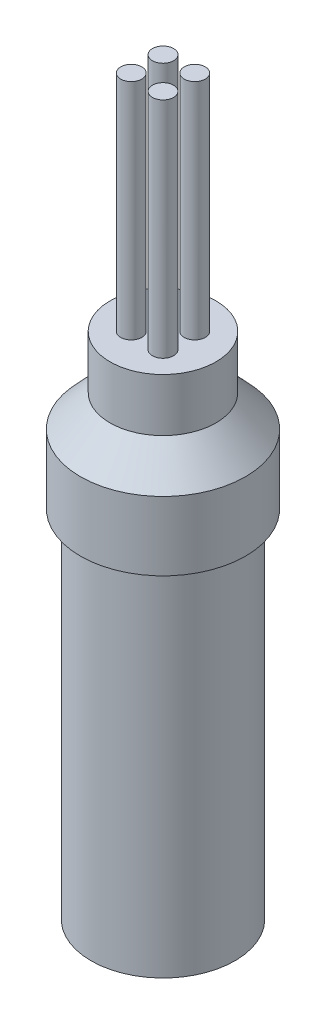
ISO-10303-21;
HEADER;
FILE_DESCRIPTION(('STEP AP214'),'2;1');
FILE_NAME('part.step','',(''),(''),'','','');
FILE_SCHEMA(('AUTOMOTIVE_DESIGN { 1 0 10303 214 1 1 1 1 }'));
ENDSEC;
DATA;
#1=APPLICATION_CONTEXT('core data for automotive mechanical design processes');
#2=APPLICATION_PROTOCOL_DEFINITION('international standard','automotive_design',2000,#1);
#3=PRODUCT_CONTEXT('',#1,'mechanical');
#4=PRODUCT('Part','Part','',(#3));
#5=PRODUCT_RELATED_PRODUCT_CATEGORY('part','',(#4));
#6=PRODUCT_DEFINITION_FORMATION('','',#4);
#7=PRODUCT_DEFINITION_CONTEXT('part definition',#1,'design');
#8=PRODUCT_DEFINITION('design','',#6,#7);
#9=PRODUCT_DEFINITION_SHAPE('','',#8);
#10=(LENGTH_UNIT() NAMED_UNIT(*) SI_UNIT(.MILLI.,.METRE.));
#11=(NAMED_UNIT(*) PLANE_ANGLE_UNIT() SI_UNIT($,.RADIAN.));
#12=(NAMED_UNIT(*) SI_UNIT($,.STERADIAN.) SOLID_ANGLE_UNIT());
#13=UNCERTAINTY_MEASURE_WITH_UNIT(LENGTH_MEASURE(1.E-05),#10,'distance_accuracy_value','');
#14=(GEOMETRIC_REPRESENTATION_CONTEXT(3) GLOBAL_UNCERTAINTY_ASSIGNED_CONTEXT((#13)) GLOBAL_UNIT_ASSIGNED_CONTEXT((#10,
#11,#12)) REPRESENTATION_CONTEXT('',''));
#15=CARTESIAN_POINT('',(0.,0.,0.));
#16=DIRECTION('',(0.,0.,1.));
#17=DIRECTION('',(1.,0.,0.));
#18=AXIS2_PLACEMENT_3D('',#15,#16,#17);
#19=CARTESIAN_POINT('',(0.,79.3219,0.));
#20=DIRECTION('',(0.,-1.,0.));
#21=DIRECTION('',(0.,0.,-1.));
#22=AXIS2_PLACEMENT_3D('',#19,#20,#21);
#23=CYLINDRICAL_SURFACE('',#22,3.3996);
#24=CARTESIAN_POINT('',(0.,60.2621,0.));
#25=DIRECTION('',(0.,1.,0.));
#26=DIRECTION('',(0.,0.,1.));
#27=AXIS2_PLACEMENT_3D('',#24,#25,#26);
#28=CIRCLE('',#27,3.3996);
#29=CARTESIAN_POINT('',(0.,60.2621,3.3996));
#30=VERTEX_POINT('',#29);
#31=EDGE_CURVE('E62',#30,#30,#28,.T.);
#32=ORIENTED_EDGE('',*,*,#31,.T.);
#33=EDGE_LOOP('',(#32));
#34=FACE_BOUND('',#33,.T.);
#35=CARTESIAN_POINT('',(0.,77.0719,0.));
#36=DIRECTION('',(0.,1.,0.));
#37=DIRECTION('',(0.,0.,1.));
#38=AXIS2_PLACEMENT_3D('',#35,#36,#37);
#39=CIRCLE('',#38,3.3996);
#40=CARTESIAN_POINT('',(0.,77.0719,3.3996));
#41=VERTEX_POINT('',#40);
#42=EDGE_CURVE('E59',#41,#41,#39,.T.);
#43=ORIENTED_EDGE('',*,*,#42,.F.);
#44=EDGE_LOOP('',(#43));
#45=FACE_BOUND('',#44,.T.);
#46=ADVANCED_FACE('F15',(#34,#45),#23,.T.);
#47=CARTESIAN_POINT('',(0.,60.2621,0.));
#48=DIRECTION('',(0.,1.,0.));
#49=DIRECTION('',(0.,0.,1.));
#50=AXIS2_PLACEMENT_3D('',#47,#48,#49);
#51=PLANE('',#50);
#52=ORIENTED_EDGE('',*,*,#31,.F.);
#53=EDGE_LOOP('',(#52));
#54=FACE_BOUND('',#53,.T.);
#55=ADVANCED_FACE('F68',(#54),#51,.F.);
#56=CARTESIAN_POINT('',(3.9,77.0719,0.));
#57=DIRECTION('',(0.,1.,0.));
#58=DIRECTION('',(0.,0.,1.));
#59=AXIS2_PLACEMENT_3D('',#56,#57,#58);
#60=PLANE('',#59);
#61=ORIENTED_EDGE('',*,*,#42,.T.);
#62=EDGE_LOOP('',(#61));
#63=FACE_BOUND('',#62,.T.);
#64=CARTESIAN_POINT('',(0.,77.0719,0.));
#65=DIRECTION('',(0.,-1.,0.));
#66=DIRECTION('',(0.,0.,-1.));
#67=AXIS2_PLACEMENT_3D('',#64,#65,#66);
#68=CIRCLE('',#67,3.9);
#69=CARTESIAN_POINT('',(0.,77.0719,-3.9));
#70=VERTEX_POINT('',#69);
#71=EDGE_CURVE('E56',#70,#70,#68,.T.);
#72=ORIENTED_EDGE('',*,*,#71,.T.);
#73=EDGE_LOOP('',(#72));
#74=FACE_BOUND('',#73,.T.);
#75=ADVANCED_FACE('F70',(#63,#74),#60,.F.);
#76=CARTESIAN_POINT('',(0.,77.0719,0.));
#77=DIRECTION('',(0.,-1.,0.));
#78=DIRECTION('',(0.,0.,-1.));
#79=AXIS2_PLACEMENT_3D('',#76,#77,#78);
#80=CYLINDRICAL_SURFACE('',#79,3.9);
#81=ORIENTED_EDGE('',*,*,#71,.F.);
#82=EDGE_LOOP('',(#81));
#83=FACE_BOUND('',#82,.T.);
#84=CARTESIAN_POINT('',(0.,80.3219,0.));
#85=DIRECTION('',(0.,-1.,0.));
#86=DIRECTION('',(0.,0.,-1.));
#87=AXIS2_PLACEMENT_3D('',#84,#85,#86);
#88=CIRCLE('',#87,3.9);
#89=CARTESIAN_POINT('',(0.,80.3219,-3.9));
#90=VERTEX_POINT('',#89);
#91=EDGE_CURVE('E53',#90,#90,#88,.T.);
#92=ORIENTED_EDGE('',*,*,#91,.T.);
#93=EDGE_LOOP('',(#92));
#94=FACE_BOUND('',#93,.T.);
#95=ADVANCED_FACE('F77',(#83,#94),#80,.T.);
#96=CARTESIAN_POINT('',(0.,81.8219,0.));
#97=DIRECTION('',(0.,-1.,0.));
#98=DIRECTION('',(0.,0.,-1.));
#99=AXIS2_PLACEMENT_3D('',#96,#97,#98);
#100=CONICAL_SURFACE('',#99,2.5,0.75092906239794);
#101=ORIENTED_EDGE('',*,*,#91,.F.);
#102=EDGE_LOOP('',(#101));
#103=FACE_BOUND('',#102,.T.);
#104=CARTESIAN_POINT('',(0.,81.8219,0.));
#105=DIRECTION('',(0.,-1.,0.));
#106=DIRECTION('',(0.,0.,-1.));
#107=AXIS2_PLACEMENT_3D('',#104,#105,#106);
#108=CIRCLE('',#107,2.5);
#109=CARTESIAN_POINT('',(0.,81.8219,-2.5));
#110=VERTEX_POINT('',#109);
#111=EDGE_CURVE('E50',#110,#110,#108,.T.);
#112=ORIENTED_EDGE('',*,*,#111,.T.);
#113=EDGE_LOOP('',(#112));
#114=FACE_BOUND('',#113,.T.);
#115=ADVANCED_FACE('F84',(#103,#114),#100,.T.);
#116=CARTESIAN_POINT('',(0.,77.0719,0.));
#117=DIRECTION('',(0.,-1.,0.));
#118=DIRECTION('',(0.,0.,-1.));
#119=AXIS2_PLACEMENT_3D('',#116,#117,#118);
#120=CYLINDRICAL_SURFACE('',#119,2.5);
#121=ORIENTED_EDGE('',*,*,#111,.F.);
#122=EDGE_LOOP('',(#121));
#123=FACE_BOUND('',#122,.T.);
#124=CARTESIAN_POINT('',(0.,84.3219,0.));
#125=DIRECTION('',(0.,-1.,0.));
#126=DIRECTION('',(0.,0.,-1.));
#127=AXIS2_PLACEMENT_3D('',#124,#125,#126);
#128=CIRCLE('',#127,2.5);
#129=CARTESIAN_POINT('',(0.,84.3219,-2.5));
#130=VERTEX_POINT('',#129);
#131=EDGE_CURVE('E47',#130,#130,#128,.T.);
#132=ORIENTED_EDGE('',*,*,#131,.T.);
#133=EDGE_LOOP('',(#132));
#134=FACE_BOUND('',#133,.T.);
#135=ADVANCED_FACE('F88',(#123,#134),#120,.T.);
#136=CARTESIAN_POINT('',(0.,84.3219,0.));
#137=DIRECTION('',(0.,-1.,0.));
#138=DIRECTION('',(0.,0.,-1.));
#139=AXIS2_PLACEMENT_3D('',#136,#137,#138);
#140=PLANE('',#139);
#141=ORIENTED_EDGE('',*,*,#131,.F.);
#142=EDGE_LOOP('',(#141));
#143=FACE_BOUND('',#142,.T.);
#144=CARTESIAN_POINT('',(0.75,84.3219,0.75));
#145=DIRECTION('',(0.,1.,0.));
#146=DIRECTION('',(0.,0.,-1.));
#147=AXIS2_PLACEMENT_3D('',#144,#145,#146);
#148=CIRCLE('',#147,0.5);
#149=CARTESIAN_POINT('',(0.75,84.3219,0.25));
#150=VERTEX_POINT('',#149);
#151=EDGE_CURVE('E44',#150,#150,#148,.T.);
#152=ORIENTED_EDGE('',*,*,#151,.F.);
#153=EDGE_LOOP('',(#152));
#154=FACE_BOUND('',#153,.T.);
#155=CARTESIAN_POINT('',(-0.75,84.3219,0.75));
#156=DIRECTION('',(0.,1.,0.));
#157=DIRECTION('',(0.,0.,-1.));
#158=AXIS2_PLACEMENT_3D('',#155,#156,#157);
#159=CIRCLE('',#158,0.5);
#160=CARTESIAN_POINT('',(-0.75,84.3219,0.25));
#161=VERTEX_POINT('',#160);
#162=EDGE_CURVE('E41',#161,#161,#159,.T.);
#163=ORIENTED_EDGE('',*,*,#162,.F.);
#164=EDGE_LOOP('',(#163));
#165=FACE_BOUND('',#164,.T.);
#166=CARTESIAN_POINT('',(-0.75,84.3219,-0.75));
#167=DIRECTION('',(0.,1.,0.));
#168=DIRECTION('',(0.,0.,-1.));
#169=AXIS2_PLACEMENT_3D('',#166,#167,#168);
#170=CIRCLE('',#169,0.5);
#171=CARTESIAN_POINT('',(-0.75,84.3219,-1.25));
#172=VERTEX_POINT('',#171);
#173=EDGE_CURVE('E38',#172,#172,#170,.T.);
#174=ORIENTED_EDGE('',*,*,#173,.F.);
#175=EDGE_LOOP('',(#174));
#176=FACE_BOUND('',#175,.T.);
#177=CARTESIAN_POINT('',(0.75,84.3219,-0.75));
#178=DIRECTION('',(0.,1.,0.));
#179=DIRECTION('',(0.,0.,-1.));
#180=AXIS2_PLACEMENT_3D('',#177,#178,#179);
#181=CIRCLE('',#180,0.5);
#182=CARTESIAN_POINT('',(0.75,84.3219,-1.25));
#183=VERTEX_POINT('',#182);
#184=EDGE_CURVE('E35',#183,#183,#181,.T.);
#185=ORIENTED_EDGE('',*,*,#184,.F.);
#186=EDGE_LOOP('',(#185));
#187=FACE_BOUND('',#186,.T.);
#188=ADVANCED_FACE('F92',(#143,#154,#165,#176,#187),#140,.F.);
#189=CARTESIAN_POINT('',(0.75,94.8948,0.75));
#190=DIRECTION('',(0.,-1.,0.));
#191=DIRECTION('',(0.,0.,-1.));
#192=AXIS2_PLACEMENT_3D('',#189,#190,#191);
#193=CYLINDRICAL_SURFACE('',#192,0.5);
#194=CARTESIAN_POINT('',(0.75,94.8948,0.75));
#195=DIRECTION('',(0.,1.,0.));
#196=DIRECTION('',(1.,0.,0.));
#197=AXIS2_PLACEMENT_3D('',#194,#195,#196);
#198=CIRCLE('',#197,0.5);
#199=CARTESIAN_POINT('',(1.25,94.8948,0.75));
#200=VERTEX_POINT('',#199);
#201=EDGE_CURVE('E30',#200,#200,#198,.T.);
#202=ORIENTED_EDGE('',*,*,#201,.F.);
#203=EDGE_LOOP('',(#202));
#204=FACE_BOUND('',#203,.T.);
#205=ORIENTED_EDGE('',*,*,#151,.T.);
#206=EDGE_LOOP('',(#205));
#207=FACE_BOUND('',#206,.T.);
#208=ADVANCED_FACE('F96',(#204,#207),#193,.T.);
#209=CARTESIAN_POINT('',(-0.75,94.8948,0.75));
#210=DIRECTION('',(0.,-1.,0.));
#211=DIRECTION('',(0.,0.,-1.));
#212=AXIS2_PLACEMENT_3D('',#209,#210,#211);
#213=CYLINDRICAL_SURFACE('',#212,0.5);
#214=CARTESIAN_POINT('',(-0.75,94.8948,0.75));
#215=DIRECTION('',(0.,1.,0.));
#216=DIRECTION('',(1.,0.,0.));
#217=AXIS2_PLACEMENT_3D('',#214,#215,#216);
#218=CIRCLE('',#217,0.5);
#219=CARTESIAN_POINT('',(-0.25,94.8948,0.75));
#220=VERTEX_POINT('',#219);
#221=EDGE_CURVE('E26',#220,#220,#218,.T.);
#222=ORIENTED_EDGE('',*,*,#221,.F.);
#223=EDGE_LOOP('',(#222));
#224=FACE_BOUND('',#223,.T.);
#225=ORIENTED_EDGE('',*,*,#162,.T.);
#226=EDGE_LOOP('',(#225));
#227=FACE_BOUND('',#226,.T.);
#228=ADVANCED_FACE('F100',(#224,#227),#213,.T.);
#229=CARTESIAN_POINT('',(-0.75,94.8948,-0.75));
#230=DIRECTION('',(0.,-1.,0.));
#231=DIRECTION('',(0.,0.,-1.));
#232=AXIS2_PLACEMENT_3D('',#229,#230,#231);
#233=CYLINDRICAL_SURFACE('',#232,0.5);
#234=CARTESIAN_POINT('',(-0.75,94.8948,-0.75));
#235=DIRECTION('',(0.,1.,0.));
#236=DIRECTION('',(1.,0.,0.));
#237=AXIS2_PLACEMENT_3D('',#234,#235,#236);
#238=CIRCLE('',#237,0.5);
#239=CARTESIAN_POINT('',(-0.25,94.8948,-0.75));
#240=VERTEX_POINT('',#239);
#241=EDGE_CURVE('E22',#240,#240,#238,.T.);
#242=ORIENTED_EDGE('',*,*,#241,.F.);
#243=EDGE_LOOP('',(#242));
#244=FACE_BOUND('',#243,.T.);
#245=ORIENTED_EDGE('',*,*,#173,.T.);
#246=EDGE_LOOP('',(#245));
#247=FACE_BOUND('',#246,.T.);
#248=ADVANCED_FACE('F104',(#244,#247),#233,.T.);
#249=CARTESIAN_POINT('',(0.75,94.8948,-0.75));
#250=DIRECTION('',(0.,-1.,0.));
#251=DIRECTION('',(0.,0.,-1.));
#252=AXIS2_PLACEMENT_3D('',#249,#250,#251);
#253=CYLINDRICAL_SURFACE('',#252,0.5);
#254=CARTESIAN_POINT('',(0.75,94.8948,-0.75));
#255=DIRECTION('',(0.,1.,0.));
#256=DIRECTION('',(1.,0.,0.));
#257=AXIS2_PLACEMENT_3D('',#254,#255,#256);
#258=CIRCLE('',#257,0.5);
#259=CARTESIAN_POINT('',(1.25,94.8948,-0.75));
#260=VERTEX_POINT('',#259);
#261=EDGE_CURVE('E10',#260,#260,#258,.T.);
#262=ORIENTED_EDGE('',*,*,#261,.F.);
#263=EDGE_LOOP('',(#262));
#264=FACE_BOUND('',#263,.T.);
#265=ORIENTED_EDGE('',*,*,#184,.T.);
#266=EDGE_LOOP('',(#265));
#267=FACE_BOUND('',#266,.T.);
#268=ADVANCED_FACE('F108',(#264,#267),#253,.T.);
#269=CARTESIAN_POINT('',(0.75,94.8948,0.75));
#270=DIRECTION('',(0.,1.,0.));
#271=DIRECTION('',(0.,0.,1.));
#272=AXIS2_PLACEMENT_3D('',#269,#270,#271);
#273=PLANE('',#272);
#274=ORIENTED_EDGE('',*,*,#201,.T.);
#275=EDGE_LOOP('',(#274));
#276=FACE_BOUND('',#275,.T.);
#277=ADVANCED_FACE('F112',(#276),#273,.T.);
#278=CARTESIAN_POINT('',(-0.75,94.8948,0.75));
#279=DIRECTION('',(0.,1.,0.));
#280=DIRECTION('',(0.,0.,1.));
#281=AXIS2_PLACEMENT_3D('',#278,#279,#280);
#282=PLANE('',#281);
#283=ORIENTED_EDGE('',*,*,#221,.T.);
#284=EDGE_LOOP('',(#283));
#285=FACE_BOUND('',#284,.T.);
#286=ADVANCED_FACE('F116',(#285),#282,.T.);
#287=CARTESIAN_POINT('',(-0.75,94.8948,-0.75));
#288=DIRECTION('',(0.,1.,0.));
#289=DIRECTION('',(0.,0.,1.));
#290=AXIS2_PLACEMENT_3D('',#287,#288,#289);
#291=PLANE('',#290);
#292=ORIENTED_EDGE('',*,*,#241,.T.);
#293=EDGE_LOOP('',(#292));
#294=FACE_BOUND('',#293,.T.);
#295=ADVANCED_FACE('F119',(#294),#291,.T.);
#296=CARTESIAN_POINT('',(0.75,94.8948,-0.75));
#297=DIRECTION('',(0.,1.,0.));
#298=DIRECTION('',(0.,0.,1.));
#299=AXIS2_PLACEMENT_3D('',#296,#297,#298);
#300=PLANE('',#299);
#301=ORIENTED_EDGE('',*,*,#261,.T.);
#302=EDGE_LOOP('',(#301));
#303=FACE_BOUND('',#302,.T.);
#304=ADVANCED_FACE('F17',(#303),#300,.T.);
#305=CLOSED_SHELL('',(#46,#55,#75,#95,#115,#135,#188,#208,#228,#248,#268,#277,#286,#295,#304));
#306=MANIFOLD_SOLID_BREP('B1',#305);
#307=ADVANCED_BREP_SHAPE_REPRESENTATION('',(#18,#306),#14);
#308=SHAPE_DEFINITION_REPRESENTATION(#9,#307);
ENDSEC;
END-ISO-10303-21;
